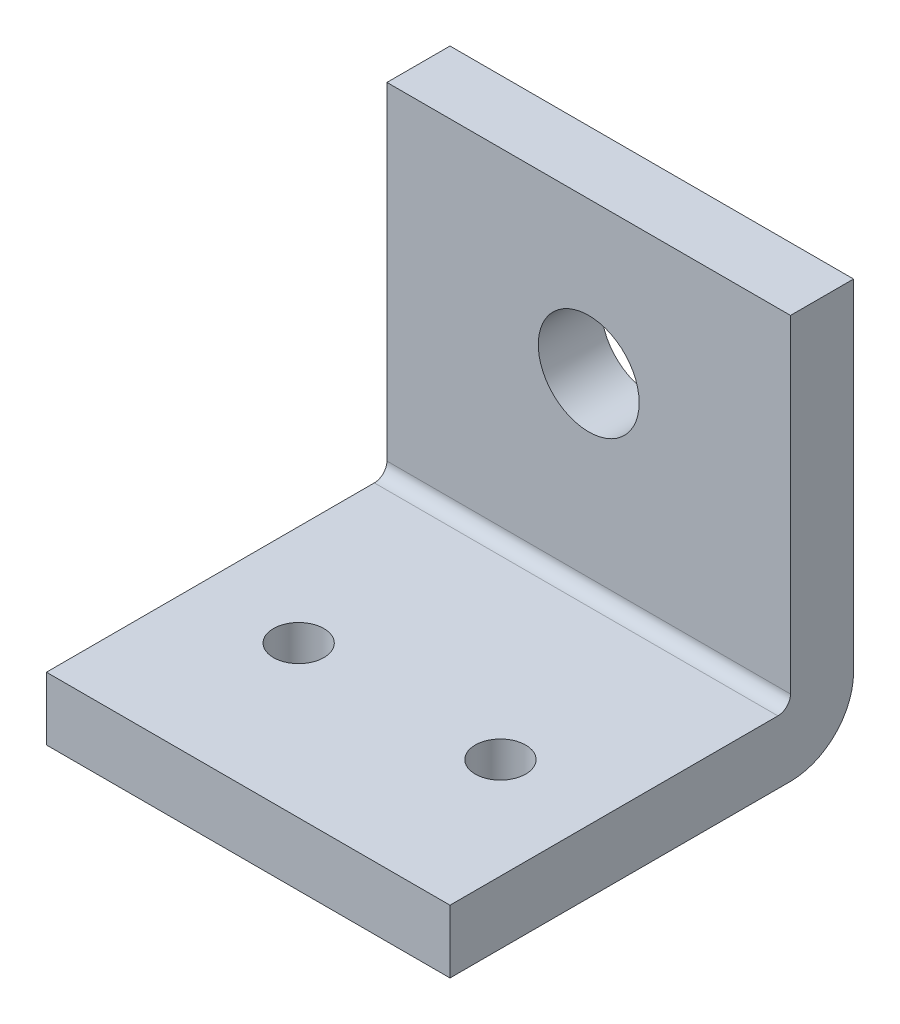
ISO-10303-21;
HEADER;
FILE_DESCRIPTION(('STEP AP214'),'2;1');
FILE_NAME('part.step','',(''),(''),'','','');
FILE_SCHEMA(('AUTOMOTIVE_DESIGN { 1 0 10303 214 1 1 1 1 }'));
ENDSEC;
DATA;
#1=APPLICATION_CONTEXT('core data for automotive mechanical design processes');
#2=APPLICATION_PROTOCOL_DEFINITION('international standard','automotive_design',2000,#1);
#3=PRODUCT_CONTEXT('',#1,'mechanical');
#4=PRODUCT('Part','Part','',(#3));
#5=PRODUCT_RELATED_PRODUCT_CATEGORY('part','',(#4));
#6=PRODUCT_DEFINITION_FORMATION('','',#4);
#7=PRODUCT_DEFINITION_CONTEXT('part definition',#1,'design');
#8=PRODUCT_DEFINITION('design','',#6,#7);
#9=PRODUCT_DEFINITION_SHAPE('','',#8);
#10=(LENGTH_UNIT() NAMED_UNIT(*) SI_UNIT(.MILLI.,.METRE.));
#11=(NAMED_UNIT(*) PLANE_ANGLE_UNIT() SI_UNIT($,.RADIAN.));
#12=(NAMED_UNIT(*) SI_UNIT($,.STERADIAN.) SOLID_ANGLE_UNIT());
#13=UNCERTAINTY_MEASURE_WITH_UNIT(LENGTH_MEASURE(1.E-05),#10,'distance_accuracy_value','');
#14=(GEOMETRIC_REPRESENTATION_CONTEXT(3) GLOBAL_UNCERTAINTY_ASSIGNED_CONTEXT((#13)) GLOBAL_UNIT_ASSIGNED_CONTEXT((#10,
#11,#12)) REPRESENTATION_CONTEXT('',''));
#15=CARTESIAN_POINT('',(0.,0.,0.));
#16=DIRECTION('',(0.,0.,1.));
#17=DIRECTION('',(1.,0.,0.));
#18=AXIS2_PLACEMENT_3D('',#15,#16,#17);
#19=CARTESIAN_POINT('',(0.,6.25,0.));
#20=DIRECTION('',(-1.,0.,0.));
#21=DIRECTION('',(0.,0.,1.));
#22=AXIS2_PLACEMENT_3D('',#19,#20,#21);
#23=PLANE('',#22);
#24=DIRECTION('',(0.,-1.,0.));
#25=VECTOR('',#24,1.);
#26=CARTESIAN_POINT('',(0.,40.,-40.));
#27=LINE('',#26,#25);
#28=CARTESIAN_POINT('',(0.,40.,-40.));
#29=VERTEX_POINT('',#28);
#30=CARTESIAN_POINT('',(0.,6.25,-40.));
#31=VERTEX_POINT('',#30);
#32=EDGE_CURVE('E134',#29,#31,#27,.T.);
#33=ORIENTED_EDGE('',*,*,#32,.T.);
#34=CARTESIAN_POINT('',(0.,6.25,-33.75));
#35=DIRECTION('',(-1.,0.,0.));
#36=DIRECTION('',(0.,0.,1.));
#37=AXIS2_PLACEMENT_3D('',#34,#35,#36);
#38=CIRCLE('',#37,6.25);
#39=CARTESIAN_POINT('',(0.,0.,-33.75));
#40=VERTEX_POINT('',#39);
#41=EDGE_CURVE('E179',#31,#40,#38,.T.);
#42=ORIENTED_EDGE('',*,*,#41,.T.);
#43=DIRECTION('',(0.,0.,-1.));
#44=VECTOR('',#43,1.);
#45=CARTESIAN_POINT('',(0.,0.,0.));
#46=LINE('',#45,#44);
#47=CARTESIAN_POINT('',(0.,0.,0.));
#48=VERTEX_POINT('',#47);
#49=EDGE_CURVE('E160',#48,#40,#46,.T.);
#50=ORIENTED_EDGE('',*,*,#49,.F.);
#51=DIRECTION('',(0.,-1.,0.));
#52=VECTOR('',#51,1.);
#53=CARTESIAN_POINT('',(0.,6.25,0.));
#54=LINE('',#53,#52);
#55=CARTESIAN_POINT('',(0.,6.25,0.));
#56=VERTEX_POINT('',#55);
#57=EDGE_CURVE('E170',#56,#48,#54,.T.);
#58=ORIENTED_EDGE('',*,*,#57,.F.);
#59=DIRECTION('',(0.,0.,-1.));
#60=VECTOR('',#59,1.);
#61=CARTESIAN_POINT('',(0.,6.25,0.));
#62=LINE('',#61,#60);
#63=CARTESIAN_POINT('',(0.,6.25,-32.5));
#64=VERTEX_POINT('',#63);
#65=EDGE_CURVE('E147',#56,#64,#62,.T.);
#66=ORIENTED_EDGE('',*,*,#65,.T.);
#67=CARTESIAN_POINT('',(0.,7.5,-32.5));
#68=DIRECTION('',(-1.,0.,0.));
#69=DIRECTION('',(0.,0.,1.));
#70=AXIS2_PLACEMENT_3D('',#67,#68,#69);
#71=CIRCLE('',#70,1.25);
#72=CARTESIAN_POINT('',(0.,7.5,-33.75));
#73=VERTEX_POINT('',#72);
#74=EDGE_CURVE('E11',#64,#73,#71,.F.);
#75=ORIENTED_EDGE('',*,*,#74,.T.);
#76=DIRECTION('',(0.,-1.,0.));
#77=VECTOR('',#76,1.);
#78=CARTESIAN_POINT('',(0.,40.,-33.75));
#79=LINE('',#78,#77);
#80=CARTESIAN_POINT('',(0.,40.,-33.75));
#81=VERTEX_POINT('',#80);
#82=EDGE_CURVE('E104',#81,#73,#79,.T.);
#83=ORIENTED_EDGE('',*,*,#82,.F.);
#84=DIRECTION('',(0.,0.,-1.));
#85=VECTOR('',#84,1.);
#86=CARTESIAN_POINT('',(0.,40.,0.));
#87=LINE('',#86,#85);
#88=EDGE_CURVE('E108',#81,#29,#87,.T.);
#89=ORIENTED_EDGE('',*,*,#88,.T.);
#90=EDGE_LOOP('',(#33,#42,#50,#58,#66,#75,#83,#89));
#91=FACE_BOUND('',#90,.T.);
#92=ADVANCED_FACE('F39',(#91),#23,.T.);
#93=CARTESIAN_POINT('',(0.,6.25,0.));
#94=DIRECTION('',(0.,0.,-1.));
#95=DIRECTION('',(-1.,0.,0.));
#96=AXIS2_PLACEMENT_3D('',#93,#94,#95);
#97=PLANE('',#96);
#98=DIRECTION('',(1.,0.,0.));
#99=VECTOR('',#98,1.);
#100=CARTESIAN_POINT('',(0.,0.,0.));
#101=LINE('',#100,#99);
#102=CARTESIAN_POINT('',(40.,0.,0.));
#103=VERTEX_POINT('',#102);
#104=EDGE_CURVE('E163',#48,#103,#101,.T.);
#105=ORIENTED_EDGE('',*,*,#104,.T.);
#106=DIRECTION('',(0.,-1.,0.));
#107=VECTOR('',#106,1.);
#108=CARTESIAN_POINT('',(40.,6.25,0.));
#109=LINE('',#108,#107);
#110=CARTESIAN_POINT('',(40.,6.25,0.));
#111=VERTEX_POINT('',#110);
#112=EDGE_CURVE('E154',#111,#103,#109,.T.);
#113=ORIENTED_EDGE('',*,*,#112,.F.);
#114=DIRECTION('',(1.,0.,0.));
#115=VECTOR('',#114,1.);
#116=CARTESIAN_POINT('',(0.,6.25,0.));
#117=LINE('',#116,#115);
#118=EDGE_CURVE('E149',#56,#111,#117,.T.);
#119=ORIENTED_EDGE('',*,*,#118,.F.);
#120=ORIENTED_EDGE('',*,*,#57,.T.);
#121=EDGE_LOOP('',(#105,#113,#119,#120));
#122=FACE_BOUND('',#121,.T.);
#123=ADVANCED_FACE('F201',(#122),#97,.F.);
#124=CARTESIAN_POINT('',(30.,6.25,-15.));
#125=DIRECTION('',(0.,-1.,0.));
#126=DIRECTION('',(0.,0.,-1.));
#127=AXIS2_PLACEMENT_3D('',#124,#125,#126);
#128=CYLINDRICAL_SURFACE('',#127,2.49999999999999);
#129=CARTESIAN_POINT('',(30.,6.25,-15.));
#130=DIRECTION('',(0.,1.,0.));
#131=DIRECTION('',(0.,0.,1.));
#132=AXIS2_PLACEMENT_3D('',#129,#130,#131);
#133=CIRCLE('',#132,2.49999999999999);
#134=CARTESIAN_POINT('',(30.,6.25,-12.5));
#135=VERTEX_POINT('',#134);
#136=EDGE_CURVE('E143',#135,#135,#133,.T.);
#137=ORIENTED_EDGE('',*,*,#136,.T.);
#138=EDGE_LOOP('',(#137));
#139=FACE_BOUND('',#138,.T.);
#140=CARTESIAN_POINT('',(30.,0.,-15.));
#141=DIRECTION('',(0.,1.,0.));
#142=DIRECTION('',(0.,0.,1.));
#143=AXIS2_PLACEMENT_3D('',#140,#141,#142);
#144=CIRCLE('',#143,2.49999999999999);
#145=CARTESIAN_POINT('',(30.,0.,-12.5));
#146=VERTEX_POINT('',#145);
#147=EDGE_CURVE('E157',#146,#146,#144,.T.);
#148=ORIENTED_EDGE('',*,*,#147,.F.);
#149=EDGE_LOOP('',(#148));
#150=FACE_BOUND('',#149,.T.);
#151=ADVANCED_FACE('F222',(#139,#150),#128,.F.);
#152=CARTESIAN_POINT('',(10.,6.25,-15.));
#153=DIRECTION('',(0.,-1.,0.));
#154=DIRECTION('',(0.,0.,-1.));
#155=AXIS2_PLACEMENT_3D('',#152,#153,#154);
#156=CYLINDRICAL_SURFACE('',#155,2.5);
#157=CARTESIAN_POINT('',(10.,6.25,-15.));
#158=DIRECTION('',(0.,1.,0.));
#159=DIRECTION('',(0.,0.,1.));
#160=AXIS2_PLACEMENT_3D('',#157,#158,#159);
#161=CIRCLE('',#160,2.5);
#162=CARTESIAN_POINT('',(10.,6.25,-12.5));
#163=VERTEX_POINT('',#162);
#164=EDGE_CURVE('E140',#163,#163,#161,.T.);
#165=ORIENTED_EDGE('',*,*,#164,.T.);
#166=EDGE_LOOP('',(#165));
#167=FACE_BOUND('',#166,.T.);
#168=CARTESIAN_POINT('',(10.,0.,-15.));
#169=DIRECTION('',(0.,1.,0.));
#170=DIRECTION('',(0.,0.,1.));
#171=AXIS2_PLACEMENT_3D('',#168,#169,#170);
#172=CIRCLE('',#171,2.5);
#173=CARTESIAN_POINT('',(10.,0.,-12.5));
#174=VERTEX_POINT('',#173);
#175=EDGE_CURVE('E114',#174,#174,#172,.T.);
#176=ORIENTED_EDGE('',*,*,#175,.F.);
#177=EDGE_LOOP('',(#176));
#178=FACE_BOUND('',#177,.T.);
#179=ADVANCED_FACE('F212',(#167,#178),#156,.F.);
#180=CARTESIAN_POINT('',(40.,6.25,0.));
#181=DIRECTION('',(-1.,0.,0.));
#182=DIRECTION('',(0.,0.,1.));
#183=AXIS2_PLACEMENT_3D('',#180,#181,#182);
#184=PLANE('',#183);
#185=DIRECTION('',(0.,0.,-1.));
#186=VECTOR('',#185,1.);
#187=CARTESIAN_POINT('',(40.,0.,0.));
#188=LINE('',#187,#186);
#189=CARTESIAN_POINT('',(40.,0.,-33.75));
#190=VERTEX_POINT('',#189);
#191=EDGE_CURVE('E144',#103,#190,#188,.T.);
#192=ORIENTED_EDGE('',*,*,#191,.T.);
#193=CARTESIAN_POINT('',(40.,6.25,-33.75));
#194=DIRECTION('',(-1.,0.,0.));
#195=DIRECTION('',(0.,0.,1.));
#196=AXIS2_PLACEMENT_3D('',#193,#194,#195);
#197=CIRCLE('',#196,6.25);
#198=CARTESIAN_POINT('',(40.,6.25,-40.));
#199=VERTEX_POINT('',#198);
#200=EDGE_CURVE('E175',#190,#199,#197,.F.);
#201=ORIENTED_EDGE('',*,*,#200,.T.);
#202=DIRECTION('',(0.,-1.,0.));
#203=VECTOR('',#202,1.);
#204=CARTESIAN_POINT('',(40.,40.,-40.));
#205=LINE('',#204,#203);
#206=CARTESIAN_POINT('',(40.,40.,-40.));
#207=VERTEX_POINT('',#206);
#208=EDGE_CURVE('E136',#207,#199,#205,.T.);
#209=ORIENTED_EDGE('',*,*,#208,.F.);
#210=DIRECTION('',(0.,0.,-1.));
#211=VECTOR('',#210,1.);
#212=CARTESIAN_POINT('',(40.,40.,0.));
#213=LINE('',#212,#211);
#214=CARTESIAN_POINT('',(40.,40.,-33.75));
#215=VERTEX_POINT('',#214);
#216=EDGE_CURVE('E122',#215,#207,#213,.T.);
#217=ORIENTED_EDGE('',*,*,#216,.F.);
#218=DIRECTION('',(0.,-1.,0.));
#219=VECTOR('',#218,1.);
#220=CARTESIAN_POINT('',(40.,40.,-33.75));
#221=LINE('',#220,#219);
#222=CARTESIAN_POINT('',(40.,7.5,-33.75));
#223=VERTEX_POINT('',#222);
#224=EDGE_CURVE('E115',#215,#223,#221,.T.);
#225=ORIENTED_EDGE('',*,*,#224,.T.);
#226=CARTESIAN_POINT('',(40.,7.5,-32.5));
#227=DIRECTION('',(-1.,0.,0.));
#228=DIRECTION('',(0.,0.,1.));
#229=AXIS2_PLACEMENT_3D('',#226,#227,#228);
#230=CIRCLE('',#229,1.25);
#231=CARTESIAN_POINT('',(40.,6.25,-32.5));
#232=VERTEX_POINT('',#231);
#233=EDGE_CURVE('E48',#223,#232,#230,.T.);
#234=ORIENTED_EDGE('',*,*,#233,.T.);
#235=DIRECTION('',(0.,0.,-1.));
#236=VECTOR('',#235,1.);
#237=CARTESIAN_POINT('',(40.,6.25,0.));
#238=LINE('',#237,#236);
#239=EDGE_CURVE('E152',#111,#232,#238,.T.);
#240=ORIENTED_EDGE('',*,*,#239,.F.);
#241=ORIENTED_EDGE('',*,*,#112,.T.);
#242=EDGE_LOOP('',(#192,#201,#209,#217,#225,#234,#240,#241));
#243=FACE_BOUND('',#242,.T.);
#244=ADVANCED_FACE('F185',(#243),#184,.F.);
#245=CARTESIAN_POINT('',(0.,6.25,0.));
#246=DIRECTION('',(0.,1.,0.));
#247=DIRECTION('',(0.,0.,1.));
#248=AXIS2_PLACEMENT_3D('',#245,#246,#247);
#249=PLANE('',#248);
#250=ORIENTED_EDGE('',*,*,#164,.F.);
#251=EDGE_LOOP('',(#250));
#252=FACE_BOUND('',#251,.T.);
#253=ORIENTED_EDGE('',*,*,#136,.F.);
#254=EDGE_LOOP('',(#253));
#255=FACE_BOUND('',#254,.T.);
#256=ORIENTED_EDGE('',*,*,#239,.T.);
#257=DIRECTION('',(1.,0.,0.));
#258=VECTOR('',#257,1.);
#259=CARTESIAN_POINT('',(0.,6.25,-32.5));
#260=LINE('',#259,#258);
#261=EDGE_CURVE('E61',#232,#64,#260,.F.);
#262=ORIENTED_EDGE('',*,*,#261,.T.);
#263=ORIENTED_EDGE('',*,*,#65,.F.);
#264=ORIENTED_EDGE('',*,*,#118,.T.);
#265=EDGE_LOOP('',(#256,#262,#263,#264));
#266=FACE_BOUND('',#265,.T.);
#267=ADVANCED_FACE('F202',(#252,#255,#266),#249,.T.);
#268=CARTESIAN_POINT('',(0.,0.,0.));
#269=DIRECTION('',(0.,1.,0.));
#270=DIRECTION('',(0.,0.,1.));
#271=AXIS2_PLACEMENT_3D('',#268,#269,#270);
#272=PLANE('',#271);
#273=ORIENTED_EDGE('',*,*,#175,.T.);
#274=EDGE_LOOP('',(#273));
#275=FACE_BOUND('',#274,.T.);
#276=ORIENTED_EDGE('',*,*,#147,.T.);
#277=EDGE_LOOP('',(#276));
#278=FACE_BOUND('',#277,.T.);
#279=ORIENTED_EDGE('',*,*,#49,.T.);
#280=DIRECTION('',(1.,0.,0.));
#281=VECTOR('',#280,1.);
#282=CARTESIAN_POINT('',(40.,0.,-33.75));
#283=LINE('',#282,#281);
#284=EDGE_CURVE('E172',#40,#190,#283,.T.);
#285=ORIENTED_EDGE('',*,*,#284,.T.);
#286=ORIENTED_EDGE('',*,*,#191,.F.);
#287=ORIENTED_EDGE('',*,*,#104,.F.);
#288=EDGE_LOOP('',(#279,#285,#286,#287));
#289=FACE_BOUND('',#288,.T.);
#290=ADVANCED_FACE('F196',(#275,#278,#289),#272,.F.);
#291=CARTESIAN_POINT('',(0.,40.,-33.75));
#292=DIRECTION('',(0.,0.,-1.));
#293=DIRECTION('',(-1.,0.,0.));
#294=AXIS2_PLACEMENT_3D('',#291,#292,#293);
#295=PLANE('',#294);
#296=CARTESIAN_POINT('',(20.,25.,-33.75));
#297=DIRECTION('',(0.,0.,1.));
#298=DIRECTION('',(1.,0.,0.));
#299=AXIS2_PLACEMENT_3D('',#296,#297,#298);
#300=CIRCLE('',#299,5.);
#301=CARTESIAN_POINT('',(25.,25.,-33.75));
#302=VERTEX_POINT('',#301);
#303=EDGE_CURVE('E129',#302,#302,#300,.T.);
#304=ORIENTED_EDGE('',*,*,#303,.F.);
#305=EDGE_LOOP('',(#304));
#306=FACE_BOUND('',#305,.T.);
#307=ORIENTED_EDGE('',*,*,#82,.T.);
#308=DIRECTION('',(1.,0.,0.));
#309=VECTOR('',#308,1.);
#310=CARTESIAN_POINT('',(0.,7.5,-33.75));
#311=LINE('',#310,#309);
#312=EDGE_CURVE('E181',#73,#223,#311,.T.);
#313=ORIENTED_EDGE('',*,*,#312,.T.);
#314=ORIENTED_EDGE('',*,*,#224,.F.);
#315=DIRECTION('',(1.,0.,0.));
#316=VECTOR('',#315,1.);
#317=CARTESIAN_POINT('',(0.,40.,-33.75));
#318=LINE('',#317,#316);
#319=EDGE_CURVE('E118',#81,#215,#318,.T.);
#320=ORIENTED_EDGE('',*,*,#319,.F.);
#321=EDGE_LOOP('',(#307,#313,#314,#320));
#322=FACE_BOUND('',#321,.T.);
#323=ADVANCED_FACE('F119',(#306,#322),#295,.F.);
#324=CARTESIAN_POINT('',(0.,40.,-40.));
#325=DIRECTION('',(0.,0.,-1.));
#326=DIRECTION('',(-1.,0.,0.));
#327=AXIS2_PLACEMENT_3D('',#324,#325,#326);
#328=PLANE('',#327);
#329=CARTESIAN_POINT('',(20.,25.,-40.));
#330=DIRECTION('',(0.,0.,-1.));
#331=DIRECTION('',(-1.,0.,0.));
#332=AXIS2_PLACEMENT_3D('',#329,#330,#331);
#333=CIRCLE('',#332,5.);
#334=CARTESIAN_POINT('',(15.,25.,-40.));
#335=VERTEX_POINT('',#334);
#336=EDGE_CURVE('E43',#335,#335,#333,.T.);
#337=ORIENTED_EDGE('',*,*,#336,.F.);
#338=EDGE_LOOP('',(#337));
#339=FACE_BOUND('',#338,.T.);
#340=ORIENTED_EDGE('',*,*,#208,.T.);
#341=DIRECTION('',(1.,0.,0.));
#342=VECTOR('',#341,1.);
#343=CARTESIAN_POINT('',(0.,6.25,-40.));
#344=LINE('',#343,#342);
#345=EDGE_CURVE('E177',#199,#31,#344,.F.);
#346=ORIENTED_EDGE('',*,*,#345,.T.);
#347=ORIENTED_EDGE('',*,*,#32,.F.);
#348=DIRECTION('',(1.,0.,0.));
#349=VECTOR('',#348,1.);
#350=CARTESIAN_POINT('',(0.,40.,-40.));
#351=LINE('',#350,#349);
#352=EDGE_CURVE('E126',#29,#207,#351,.T.);
#353=ORIENTED_EDGE('',*,*,#352,.T.);
#354=EDGE_LOOP('',(#340,#346,#347,#353));
#355=FACE_BOUND('',#354,.T.);
#356=ADVANCED_FACE('F189',(#339,#355),#328,.T.);
#357=CARTESIAN_POINT('',(0.,40.,0.));
#358=DIRECTION('',(0.,1.,0.));
#359=DIRECTION('',(0.,0.,1.));
#360=AXIS2_PLACEMENT_3D('',#357,#358,#359);
#361=PLANE('',#360);
#362=ORIENTED_EDGE('',*,*,#88,.F.);
#363=ORIENTED_EDGE('',*,*,#319,.T.);
#364=ORIENTED_EDGE('',*,*,#216,.T.);
#365=ORIENTED_EDGE('',*,*,#352,.F.);
#366=EDGE_LOOP('',(#362,#363,#364,#365));
#367=FACE_BOUND('',#366,.T.);
#368=ADVANCED_FACE('F124',(#367),#361,.T.);
#369=CARTESIAN_POINT('',(0.,6.25,-33.75));
#370=DIRECTION('',(-1.,0.,0.));
#371=DIRECTION('',(0.,0.,1.));
#372=AXIS2_PLACEMENT_3D('',#369,#370,#371);
#373=CYLINDRICAL_SURFACE('',#372,6.25);
#374=ORIENTED_EDGE('',*,*,#41,.F.);
#375=ORIENTED_EDGE('',*,*,#345,.F.);
#376=ORIENTED_EDGE('',*,*,#200,.F.);
#377=ORIENTED_EDGE('',*,*,#284,.F.);
#378=EDGE_LOOP('',(#374,#375,#376,#377));
#379=FACE_BOUND('',#378,.T.);
#380=ADVANCED_FACE('F194',(#379),#373,.T.);
#381=CARTESIAN_POINT('',(0.,7.5,-32.5));
#382=DIRECTION('',(1.,0.,0.));
#383=DIRECTION('',(0.,0.,-1.));
#384=AXIS2_PLACEMENT_3D('',#381,#382,#383);
#385=CYLINDRICAL_SURFACE('',#384,1.25);
#386=ORIENTED_EDGE('',*,*,#74,.F.);
#387=ORIENTED_EDGE('',*,*,#261,.F.);
#388=ORIENTED_EDGE('',*,*,#233,.F.);
#389=ORIENTED_EDGE('',*,*,#312,.F.);
#390=EDGE_LOOP('',(#386,#387,#388,#389));
#391=FACE_BOUND('',#390,.T.);
#392=ADVANCED_FACE('F41',(#391),#385,.F.);
#393=CARTESIAN_POINT('',(20.,25.,-73.75));
#394=DIRECTION('',(0.,0.,1.));
#395=DIRECTION('',(1.,0.,0.));
#396=AXIS2_PLACEMENT_3D('',#393,#394,#395);
#397=CYLINDRICAL_SURFACE('',#396,5.);
#398=ORIENTED_EDGE('',*,*,#336,.T.);
#399=EDGE_LOOP('',(#398));
#400=FACE_BOUND('',#399,.T.);
#401=ORIENTED_EDGE('',*,*,#303,.T.);
#402=EDGE_LOOP('',(#401));
#403=FACE_BOUND('',#402,.T.);
#404=ADVANCED_FACE('F235',(#400,#403),#397,.F.);
#405=CLOSED_SHELL('',(#92,#123,#151,#179,#244,#267,#290,#323,#356,#368,#380,#392,#404));
#406=MANIFOLD_SOLID_BREP('B2',#405);
#407=ADVANCED_BREP_SHAPE_REPRESENTATION('',(#18,#406),#14);
#408=SHAPE_DEFINITION_REPRESENTATION(#9,#407);
ENDSEC;
END-ISO-10303-21;
